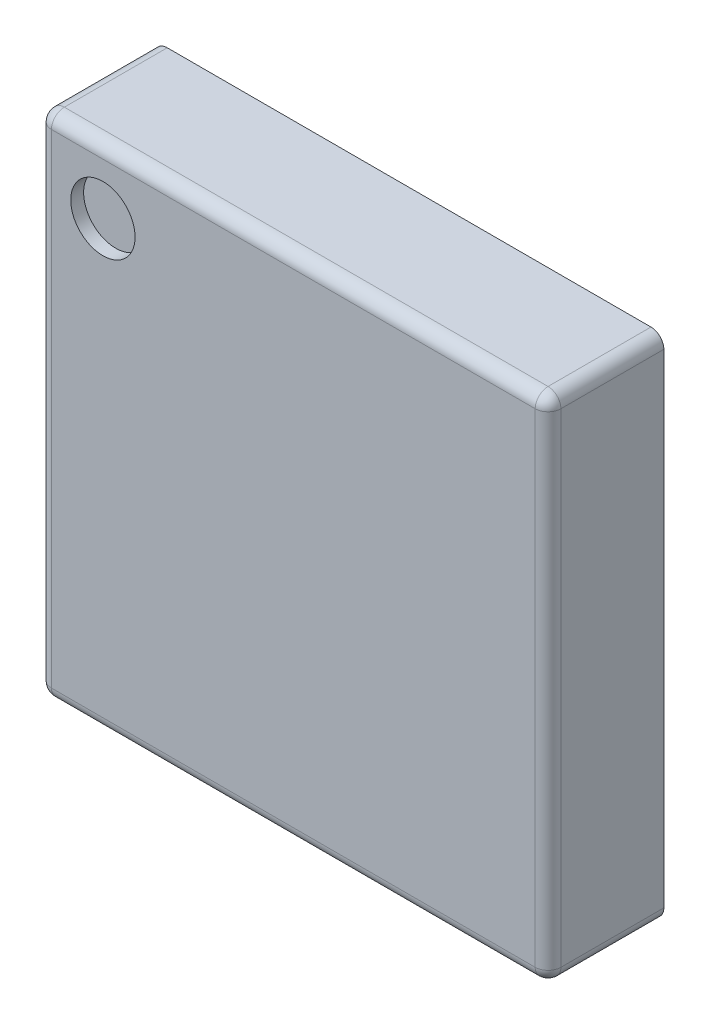
ISO-10303-21;
HEADER;
FILE_DESCRIPTION(('STEP AP214'),'2;1');
FILE_NAME('part.step','',(''),(''),'','','');
FILE_SCHEMA(('AUTOMOTIVE_DESIGN { 1 0 10303 214 1 1 1 1 }'));
ENDSEC;
DATA;
#1=APPLICATION_CONTEXT('core data for automotive mechanical design processes');
#2=APPLICATION_PROTOCOL_DEFINITION('international standard','automotive_design',2000,#1);
#3=PRODUCT_CONTEXT('',#1,'mechanical');
#4=PRODUCT('Part','Part','',(#3));
#5=PRODUCT_RELATED_PRODUCT_CATEGORY('part','',(#4));
#6=PRODUCT_DEFINITION_FORMATION('','',#4);
#7=PRODUCT_DEFINITION_CONTEXT('part definition',#1,'design');
#8=PRODUCT_DEFINITION('design','',#6,#7);
#9=PRODUCT_DEFINITION_SHAPE('','',#8);
#10=(LENGTH_UNIT() NAMED_UNIT(*) SI_UNIT(.MILLI.,.METRE.));
#11=(NAMED_UNIT(*) PLANE_ANGLE_UNIT() SI_UNIT($,.RADIAN.));
#12=(NAMED_UNIT(*) SI_UNIT($,.STERADIAN.) SOLID_ANGLE_UNIT());
#13=UNCERTAINTY_MEASURE_WITH_UNIT(LENGTH_MEASURE(1.E-05),#10,'distance_accuracy_value','');
#14=(GEOMETRIC_REPRESENTATION_CONTEXT(3) GLOBAL_UNCERTAINTY_ASSIGNED_CONTEXT((#13)) GLOBAL_UNIT_ASSIGNED_CONTEXT((#10,
#11,#12)) REPRESENTATION_CONTEXT('',''));
#15=CARTESIAN_POINT('',(0.,0.,0.));
#16=DIRECTION('',(0.,0.,1.));
#17=DIRECTION('',(1.,0.,0.));
#18=AXIS2_PLACEMENT_3D('',#15,#16,#17);
#19=CARTESIAN_POINT('',(0.,1.98,0.92));
#20=DIRECTION('',(0.,1.,0.));
#21=DIRECTION('',(1.,0.,0.));
#22=AXIS2_PLACEMENT_3D('',#19,#20,#21);
#23=PLANE('',#22);
#24=DIRECTION('',(1.,0.,0.));
#25=VECTOR('',#24,1.);
#26=CARTESIAN_POINT('',(0.,1.98,0.02));
#27=LINE('',#26,#25);
#28=CARTESIAN_POINT('',(-1.88,1.98,0.02));
#29=VERTEX_POINT('',#28);
#30=CARTESIAN_POINT('',(1.88,1.98,0.02));
#31=VERTEX_POINT('',#30);
#32=EDGE_CURVE('E39',#29,#31,#27,.T.);
#33=ORIENTED_EDGE('',*,*,#32,.F.);
#34=DIRECTION('',(0.,0.,1.));
#35=VECTOR('',#34,1.);
#36=CARTESIAN_POINT('',(-1.88,1.98,0.92));
#37=LINE('',#36,#35);
#38=CARTESIAN_POINT('',(-1.88,1.98,0.82));
#39=VERTEX_POINT('',#38);
#40=EDGE_CURVE('E11',#29,#39,#37,.T.);
#41=ORIENTED_EDGE('',*,*,#40,.T.);
#42=DIRECTION('',(1.,0.,0.));
#43=VECTOR('',#42,1.);
#44=CARTESIAN_POINT('',(0.,1.98,0.82));
#45=LINE('',#44,#43);
#46=CARTESIAN_POINT('',(1.88,1.98,0.82));
#47=VERTEX_POINT('',#46);
#48=EDGE_CURVE('E28',#39,#47,#45,.T.);
#49=ORIENTED_EDGE('',*,*,#48,.T.);
#50=DIRECTION('',(0.,0.,-1.));
#51=VECTOR('',#50,1.);
#52=CARTESIAN_POINT('',(1.88,1.98,0.92));
#53=LINE('',#52,#51);
#54=EDGE_CURVE('E138',#47,#31,#53,.T.);
#55=ORIENTED_EDGE('',*,*,#54,.T.);
#56=EDGE_LOOP('',(#33,#41,#49,#55));
#57=FACE_BOUND('',#56,.T.);
#58=ADVANCED_FACE('F17',(#57),#23,.T.);
#59=CARTESIAN_POINT('',(-1.98,0.,0.92));
#60=DIRECTION('',(1.,0.,0.));
#61=DIRECTION('',(0.,1.,0.));
#62=AXIS2_PLACEMENT_3D('',#59,#60,#61);
#63=PLANE('',#62);
#64=DIRECTION('',(0.,1.,0.));
#65=VECTOR('',#64,1.);
#66=CARTESIAN_POINT('',(-1.98,1.98,0.82));
#67=LINE('',#66,#65);
#68=CARTESIAN_POINT('',(-1.98,-1.88,0.82));
#69=VERTEX_POINT('',#68);
#70=CARTESIAN_POINT('',(-1.98,1.88,0.82));
#71=VERTEX_POINT('',#70);
#72=EDGE_CURVE('E144',#69,#71,#67,.T.);
#73=ORIENTED_EDGE('',*,*,#72,.T.);
#74=DIRECTION('',(0.,0.,-1.));
#75=VECTOR('',#74,1.);
#76=CARTESIAN_POINT('',(-1.98,1.88,0.02));
#77=LINE('',#76,#75);
#78=CARTESIAN_POINT('',(-1.98,1.88,0.02));
#79=VERTEX_POINT('',#78);
#80=EDGE_CURVE('E185',#71,#79,#77,.T.);
#81=ORIENTED_EDGE('',*,*,#80,.T.);
#82=DIRECTION('',(0.,-1.,0.));
#83=VECTOR('',#82,1.);
#84=CARTESIAN_POINT('',(-1.98,0.,0.02));
#85=LINE('',#84,#83);
#86=CARTESIAN_POINT('',(-1.98,-1.88,0.02));
#87=VERTEX_POINT('',#86);
#88=EDGE_CURVE('E251',#79,#87,#85,.T.);
#89=ORIENTED_EDGE('',*,*,#88,.T.);
#90=DIRECTION('',(0.,0.,1.));
#91=VECTOR('',#90,1.);
#92=CARTESIAN_POINT('',(-1.98,-1.88,0.92));
#93=LINE('',#92,#91);
#94=EDGE_CURVE('E191',#87,#69,#93,.T.);
#95=ORIENTED_EDGE('',*,*,#94,.T.);
#96=EDGE_LOOP('',(#73,#81,#89,#95));
#97=FACE_BOUND('',#96,.T.);
#98=ADVANCED_FACE('F421',(#97),#63,.F.);
#99=CARTESIAN_POINT('',(0.,-1.98,0.92));
#100=DIRECTION('',(0.,1.,0.));
#101=DIRECTION('',(1.,0.,0.));
#102=AXIS2_PLACEMENT_3D('',#99,#100,#101);
#103=PLANE('',#102);
#104=DIRECTION('',(-1.,0.,0.));
#105=VECTOR('',#104,1.);
#106=CARTESIAN_POINT('',(-1.98,-1.98,0.82));
#107=LINE('',#106,#105);
#108=CARTESIAN_POINT('',(1.88,-1.98,0.82));
#109=VERTEX_POINT('',#108);
#110=CARTESIAN_POINT('',(-1.88,-1.98,0.82));
#111=VERTEX_POINT('',#110);
#112=EDGE_CURVE('E187',#109,#111,#107,.T.);
#113=ORIENTED_EDGE('',*,*,#112,.T.);
#114=DIRECTION('',(0.,0.,-1.));
#115=VECTOR('',#114,1.);
#116=CARTESIAN_POINT('',(-1.88,-1.98,0.92));
#117=LINE('',#116,#115);
#118=CARTESIAN_POINT('',(-1.88,-1.98,0.02));
#119=VERTEX_POINT('',#118);
#120=EDGE_CURVE('E192',#111,#119,#117,.T.);
#121=ORIENTED_EDGE('',*,*,#120,.T.);
#122=DIRECTION('',(1.,0.,0.));
#123=VECTOR('',#122,1.);
#124=CARTESIAN_POINT('',(0.,-1.98,0.02));
#125=LINE('',#124,#123);
#126=CARTESIAN_POINT('',(1.88,-1.98,0.02));
#127=VERTEX_POINT('',#126);
#128=EDGE_CURVE('E171',#119,#127,#125,.T.);
#129=ORIENTED_EDGE('',*,*,#128,.T.);
#130=DIRECTION('',(0.,0.,1.));
#131=VECTOR('',#130,1.);
#132=CARTESIAN_POINT('',(1.88,-1.98,0.92));
#133=LINE('',#132,#131);
#134=EDGE_CURVE('E255',#127,#109,#133,.T.);
#135=ORIENTED_EDGE('',*,*,#134,.T.);
#136=EDGE_LOOP('',(#113,#121,#129,#135));
#137=FACE_BOUND('',#136,.T.);
#138=ADVANCED_FACE('F328',(#137),#103,.F.);
#139=CARTESIAN_POINT('',(1.98,0.,0.92));
#140=DIRECTION('',(1.,0.,0.));
#141=DIRECTION('',(0.,1.,0.));
#142=AXIS2_PLACEMENT_3D('',#139,#140,#141);
#143=PLANE('',#142);
#144=DIRECTION('',(0.,-1.,0.));
#145=VECTOR('',#144,1.);
#146=CARTESIAN_POINT('',(1.98,0.,0.82));
#147=LINE('',#146,#145);
#148=CARTESIAN_POINT('',(1.98,1.88,0.82));
#149=VERTEX_POINT('',#148);
#150=CARTESIAN_POINT('',(1.98,-1.88,0.82));
#151=VERTEX_POINT('',#150);
#152=EDGE_CURVE('E258',#149,#151,#147,.T.);
#153=ORIENTED_EDGE('',*,*,#152,.T.);
#154=DIRECTION('',(0.,0.,-1.));
#155=VECTOR('',#154,1.);
#156=CARTESIAN_POINT('',(1.98,-1.88,0.02));
#157=LINE('',#156,#155);
#158=CARTESIAN_POINT('',(1.98,-1.88,0.02));
#159=VERTEX_POINT('',#158);
#160=EDGE_CURVE('E212',#151,#159,#157,.T.);
#161=ORIENTED_EDGE('',*,*,#160,.T.);
#162=DIRECTION('',(0.,-1.,0.));
#163=VECTOR('',#162,1.);
#164=CARTESIAN_POINT('',(1.98,0.,0.02));
#165=LINE('',#164,#163);
#166=CARTESIAN_POINT('',(1.98,1.88,0.02));
#167=VERTEX_POINT('',#166);
#168=EDGE_CURVE('E208',#167,#159,#165,.T.);
#169=ORIENTED_EDGE('',*,*,#168,.F.);
#170=DIRECTION('',(0.,0.,1.));
#171=VECTOR('',#170,1.);
#172=CARTESIAN_POINT('',(1.98,1.88,0.92));
#173=LINE('',#172,#171);
#174=EDGE_CURVE('E177',#167,#149,#173,.T.);
#175=ORIENTED_EDGE('',*,*,#174,.T.);
#176=EDGE_LOOP('',(#153,#161,#169,#175));
#177=FACE_BOUND('',#176,.T.);
#178=ADVANCED_FACE('F323',(#177),#143,.T.);
#179=CARTESIAN_POINT('',(0.,0.,0.92));
#180=DIRECTION('',(0.,0.,1.));
#181=DIRECTION('',(1.,0.,0.));
#182=AXIS2_PLACEMENT_3D('',#179,#180,#181);
#183=PLANE('',#182);
#184=DIRECTION('',(0.,-1.,0.));
#185=VECTOR('',#184,1.);
#186=CARTESIAN_POINT('',(-1.88,-1.98,0.92));
#187=LINE('',#186,#185);
#188=CARTESIAN_POINT('',(-1.88,1.88,0.92));
#189=VERTEX_POINT('',#188);
#190=CARTESIAN_POINT('',(-1.88,-1.88,0.92));
#191=VERTEX_POINT('',#190);
#192=EDGE_CURVE('E173',#189,#191,#187,.T.);
#193=ORIENTED_EDGE('',*,*,#192,.T.);
#194=DIRECTION('',(1.,0.,0.));
#195=VECTOR('',#194,1.);
#196=CARTESIAN_POINT('',(1.98,-1.88,0.92));
#197=LINE('',#196,#195);
#198=CARTESIAN_POINT('',(1.88,-1.88,0.92));
#199=VERTEX_POINT('',#198);
#200=EDGE_CURVE('E178',#191,#199,#197,.T.);
#201=ORIENTED_EDGE('',*,*,#200,.T.);
#202=DIRECTION('',(0.,1.,0.));
#203=VECTOR('',#202,1.);
#204=CARTESIAN_POINT('',(1.88,0.,0.92));
#205=LINE('',#204,#203);
#206=CARTESIAN_POINT('',(1.88,1.88,0.92));
#207=VERTEX_POINT('',#206);
#208=EDGE_CURVE('E199',#199,#207,#205,.T.);
#209=ORIENTED_EDGE('',*,*,#208,.T.);
#210=DIRECTION('',(-1.,0.,0.));
#211=VECTOR('',#210,1.);
#212=CARTESIAN_POINT('',(0.,1.88,0.92));
#213=LINE('',#212,#211);
#214=EDGE_CURVE('E154',#207,#189,#213,.T.);
#215=ORIENTED_EDGE('',*,*,#214,.T.);
#216=EDGE_LOOP('',(#193,#201,#209,#215));
#217=FACE_BOUND('',#216,.T.);
#218=CARTESIAN_POINT('',(-1.48,1.48,0.92));
#219=DIRECTION('',(0.,0.,1.));
#220=DIRECTION('',(1.,0.,0.));
#221=AXIS2_PLACEMENT_3D('',#218,#219,#220);
#222=CIRCLE('',#221,0.25);
#223=CARTESIAN_POINT('',(-1.23,1.48,0.92));
#224=VERTEX_POINT('',#223);
#225=EDGE_CURVE('E235',#224,#224,#222,.T.);
#226=ORIENTED_EDGE('',*,*,#225,.F.);
#227=EDGE_LOOP('',(#226));
#228=FACE_BOUND('',#227,.T.);
#229=ADVANCED_FACE('F274',(#217,#228),#183,.T.);
#230=CARTESIAN_POINT('',(0.,0.,0.02));
#231=DIRECTION('',(0.,0.,1.));
#232=DIRECTION('',(1.,0.,0.));
#233=AXIS2_PLACEMENT_3D('',#230,#231,#232);
#234=PLANE('',#233);
#235=ORIENTED_EDGE('',*,*,#88,.F.);
#236=CARTESIAN_POINT('',(-1.88,1.88,0.02));
#237=DIRECTION('',(0.,0.,-1.));
#238=DIRECTION('',(1.,0.,0.));
#239=AXIS2_PLACEMENT_3D('',#236,#237,#238);
#240=CIRCLE('',#239,0.1);
#241=EDGE_CURVE('E200',#79,#29,#240,.T.);
#242=ORIENTED_EDGE('',*,*,#241,.T.);
#243=ORIENTED_EDGE('',*,*,#32,.T.);
#244=CARTESIAN_POINT('',(1.88,1.88,0.02));
#245=DIRECTION('',(0.,0.,-1.));
#246=DIRECTION('',(1.,0.,0.));
#247=AXIS2_PLACEMENT_3D('',#244,#245,#246);
#248=CIRCLE('',#247,0.1);
#249=EDGE_CURVE('E142',#31,#167,#248,.T.);
#250=ORIENTED_EDGE('',*,*,#249,.T.);
#251=ORIENTED_EDGE('',*,*,#168,.T.);
#252=CARTESIAN_POINT('',(1.88,-1.88,0.02));
#253=DIRECTION('',(0.,0.,-1.));
#254=DIRECTION('',(1.,0.,0.));
#255=AXIS2_PLACEMENT_3D('',#252,#253,#254);
#256=CIRCLE('',#255,0.1);
#257=EDGE_CURVE('E204',#159,#127,#256,.T.);
#258=ORIENTED_EDGE('',*,*,#257,.T.);
#259=ORIENTED_EDGE('',*,*,#128,.F.);
#260=CARTESIAN_POINT('',(-1.88,-1.88,0.02));
#261=DIRECTION('',(0.,0.,-1.));
#262=DIRECTION('',(1.,0.,0.));
#263=AXIS2_PLACEMENT_3D('',#260,#261,#262);
#264=CIRCLE('',#263,0.1);
#265=EDGE_CURVE('E209',#119,#87,#264,.T.);
#266=ORIENTED_EDGE('',*,*,#265,.T.);
#267=EDGE_LOOP('',(#235,#242,#243,#250,#251,#258,#259,#266));
#268=FACE_BOUND('',#267,.T.);
#269=ADVANCED_FACE('F321',(#268),#234,.F.);
#270=CARTESIAN_POINT('',(1.88,-1.88,0.92));
#271=DIRECTION('',(0.,0.,1.));
#272=DIRECTION('',(1.,0.,0.));
#273=AXIS2_PLACEMENT_3D('',#270,#271,#272);
#274=CYLINDRICAL_SURFACE('',#273,0.1);
#275=CARTESIAN_POINT('',(1.88,-1.88,0.82));
#276=DIRECTION('',(0.,0.,1.));
#277=DIRECTION('',(1.,0.,0.));
#278=AXIS2_PLACEMENT_3D('',#275,#276,#277);
#279=CIRCLE('',#278,0.1);
#280=EDGE_CURVE('E196',#109,#151,#279,.T.);
#281=ORIENTED_EDGE('',*,*,#280,.F.);
#282=ORIENTED_EDGE('',*,*,#134,.F.);
#283=ORIENTED_EDGE('',*,*,#257,.F.);
#284=ORIENTED_EDGE('',*,*,#160,.F.);
#285=EDGE_LOOP('',(#281,#282,#283,#284));
#286=FACE_BOUND('',#285,.T.);
#287=ADVANCED_FACE('F325',(#286),#274,.T.);
#288=CARTESIAN_POINT('',(1.88,-1.88,0.82));
#289=DIRECTION('',(1.,0.,0.));
#290=DIRECTION('',(0.,0.,-1.));
#291=AXIS2_PLACEMENT_3D('',#288,#289,#290);
#292=SPHERICAL_SURFACE('',#291,0.1);
#293=CARTESIAN_POINT('',(1.88,-1.88,0.82));
#294=DIRECTION('',(-1.,0.,0.));
#295=DIRECTION('',(0.,0.,-1.));
#296=AXIS2_PLACEMENT_3D('',#293,#294,#295);
#297=CIRCLE('',#296,0.1);
#298=EDGE_CURVE('E179',#109,#199,#297,.T.);
#299=ORIENTED_EDGE('',*,*,#298,.F.);
#300=ORIENTED_EDGE('',*,*,#280,.T.);
#301=CARTESIAN_POINT('',(1.88,-1.88,0.82));
#302=DIRECTION('',(0.,1.,0.));
#303=DIRECTION('',(0.,0.,-1.));
#304=AXIS2_PLACEMENT_3D('',#301,#302,#303);
#305=CIRCLE('',#304,0.1);
#306=EDGE_CURVE('E182',#199,#151,#305,.T.);
#307=ORIENTED_EDGE('',*,*,#306,.F.);
#308=EDGE_LOOP('',(#299,#300,#307));
#309=FACE_BOUND('',#308,.T.);
#310=ADVANCED_FACE('F288',(#309),#292,.T.);
#311=CARTESIAN_POINT('',(1.88,1.88,0.92));
#312=DIRECTION('',(0.,0.,-1.));
#313=DIRECTION('',(-1.,0.,0.));
#314=AXIS2_PLACEMENT_3D('',#311,#312,#313);
#315=CYLINDRICAL_SURFACE('',#314,0.1);
#316=ORIENTED_EDGE('',*,*,#249,.F.);
#317=ORIENTED_EDGE('',*,*,#54,.F.);
#318=CARTESIAN_POINT('',(1.88,1.88,0.82));
#319=DIRECTION('',(0.,0.,1.));
#320=DIRECTION('',(1.,0.,0.));
#321=AXIS2_PLACEMENT_3D('',#318,#319,#320);
#322=CIRCLE('',#321,0.1);
#323=EDGE_CURVE('E125',#149,#47,#322,.T.);
#324=ORIENTED_EDGE('',*,*,#323,.F.);
#325=ORIENTED_EDGE('',*,*,#174,.F.);
#326=EDGE_LOOP('',(#316,#317,#324,#325));
#327=FACE_BOUND('',#326,.T.);
#328=ADVANCED_FACE('F140',(#327),#315,.T.);
#329=CARTESIAN_POINT('',(1.88,0.,0.82));
#330=DIRECTION('',(0.,-1.,0.));
#331=DIRECTION('',(0.,0.,-1.));
#332=AXIS2_PLACEMENT_3D('',#329,#330,#331);
#333=CYLINDRICAL_SURFACE('',#332,0.1);
#334=ORIENTED_EDGE('',*,*,#306,.T.);
#335=ORIENTED_EDGE('',*,*,#152,.F.);
#336=CARTESIAN_POINT('',(1.88,1.88,0.82));
#337=DIRECTION('',(0.,1.,0.));
#338=DIRECTION('',(0.,0.,1.));
#339=AXIS2_PLACEMENT_3D('',#336,#337,#338);
#340=CIRCLE('',#339,0.1);
#341=EDGE_CURVE('E130',#207,#149,#340,.T.);
#342=ORIENTED_EDGE('',*,*,#341,.F.);
#343=ORIENTED_EDGE('',*,*,#208,.F.);
#344=EDGE_LOOP('',(#334,#335,#342,#343));
#345=FACE_BOUND('',#344,.T.);
#346=ADVANCED_FACE('F291',(#345),#333,.T.);
#347=CARTESIAN_POINT('',(0.,-1.88,0.82));
#348=DIRECTION('',(-1.,0.,0.));
#349=DIRECTION('',(0.,-1.,0.));
#350=AXIS2_PLACEMENT_3D('',#347,#348,#349);
#351=CYLINDRICAL_SURFACE('',#350,0.1);
#352=ORIENTED_EDGE('',*,*,#298,.T.);
#353=ORIENTED_EDGE('',*,*,#200,.F.);
#354=CARTESIAN_POINT('',(-1.88,-1.88,0.82));
#355=DIRECTION('',(-1.,0.,0.));
#356=DIRECTION('',(0.,0.,1.));
#357=AXIS2_PLACEMENT_3D('',#354,#355,#356);
#358=CIRCLE('',#357,0.1);
#359=EDGE_CURVE('E157',#111,#191,#358,.T.);
#360=ORIENTED_EDGE('',*,*,#359,.F.);
#361=ORIENTED_EDGE('',*,*,#112,.F.);
#362=EDGE_LOOP('',(#352,#353,#360,#361));
#363=FACE_BOUND('',#362,.T.);
#364=ADVANCED_FACE('F287',(#363),#351,.T.);
#365=CARTESIAN_POINT('',(-1.88,-1.88,0.92));
#366=DIRECTION('',(0.,0.,-1.));
#367=DIRECTION('',(-1.,0.,0.));
#368=AXIS2_PLACEMENT_3D('',#365,#366,#367);
#369=CYLINDRICAL_SURFACE('',#368,0.1);
#370=ORIENTED_EDGE('',*,*,#265,.F.);
#371=ORIENTED_EDGE('',*,*,#120,.F.);
#372=CARTESIAN_POINT('',(-1.88,-1.88,0.82));
#373=DIRECTION('',(0.,0.,1.));
#374=DIRECTION('',(1.,0.,0.));
#375=AXIS2_PLACEMENT_3D('',#372,#373,#374);
#376=CIRCLE('',#375,0.1);
#377=EDGE_CURVE('E135',#69,#111,#376,.T.);
#378=ORIENTED_EDGE('',*,*,#377,.F.);
#379=ORIENTED_EDGE('',*,*,#94,.F.);
#380=EDGE_LOOP('',(#370,#371,#378,#379));
#381=FACE_BOUND('',#380,.T.);
#382=ADVANCED_FACE('F453',(#381),#369,.T.);
#383=CARTESIAN_POINT('',(1.88,1.88,0.82));
#384=DIRECTION('',(1.,0.,0.));
#385=DIRECTION('',(0.,0.,-1.));
#386=AXIS2_PLACEMENT_3D('',#383,#384,#385);
#387=SPHERICAL_SURFACE('',#386,0.1);
#388=ORIENTED_EDGE('',*,*,#341,.T.);
#389=ORIENTED_EDGE('',*,*,#323,.T.);
#390=CARTESIAN_POINT('',(1.88,1.88,0.82));
#391=DIRECTION('',(-1.,0.,0.));
#392=DIRECTION('',(0.,0.,-1.));
#393=AXIS2_PLACEMENT_3D('',#390,#391,#392);
#394=CIRCLE('',#393,0.1);
#395=EDGE_CURVE('E129',#207,#47,#394,.T.);
#396=ORIENTED_EDGE('',*,*,#395,.F.);
#397=EDGE_LOOP('',(#388,#389,#396));
#398=FACE_BOUND('',#397,.T.);
#399=ADVANCED_FACE('F127',(#398),#387,.T.);
#400=CARTESIAN_POINT('',(-1.88,-1.88,0.82));
#401=DIRECTION('',(0.,-1.,0.));
#402=DIRECTION('',(0.,0.,-1.));
#403=AXIS2_PLACEMENT_3D('',#400,#401,#402);
#404=SPHERICAL_SURFACE('',#403,0.1);
#405=ORIENTED_EDGE('',*,*,#377,.T.);
#406=ORIENTED_EDGE('',*,*,#359,.T.);
#407=CARTESIAN_POINT('',(-1.88,-1.88,0.82));
#408=DIRECTION('',(0.,1.,0.));
#409=DIRECTION('',(0.,0.,-1.));
#410=AXIS2_PLACEMENT_3D('',#407,#408,#409);
#411=CIRCLE('',#410,0.1);
#412=EDGE_CURVE('E158',#69,#191,#411,.T.);
#413=ORIENTED_EDGE('',*,*,#412,.F.);
#414=EDGE_LOOP('',(#405,#406,#413));
#415=FACE_BOUND('',#414,.T.);
#416=ADVANCED_FACE('F282',(#415),#404,.T.);
#417=CARTESIAN_POINT('',(0.,1.88,0.82));
#418=DIRECTION('',(1.,0.,0.));
#419=DIRECTION('',(0.,1.,0.));
#420=AXIS2_PLACEMENT_3D('',#417,#418,#419);
#421=CYLINDRICAL_SURFACE('',#420,0.1);
#422=ORIENTED_EDGE('',*,*,#395,.T.);
#423=ORIENTED_EDGE('',*,*,#48,.F.);
#424=CARTESIAN_POINT('',(-1.88,1.88,0.82));
#425=DIRECTION('',(-1.,0.,0.));
#426=DIRECTION('',(0.,0.,1.));
#427=AXIS2_PLACEMENT_3D('',#424,#425,#426);
#428=CIRCLE('',#427,0.1);
#429=EDGE_CURVE('E21',#189,#39,#428,.T.);
#430=ORIENTED_EDGE('',*,*,#429,.F.);
#431=ORIENTED_EDGE('',*,*,#214,.F.);
#432=EDGE_LOOP('',(#422,#423,#430,#431));
#433=FACE_BOUND('',#432,.T.);
#434=ADVANCED_FACE('F152',(#433),#421,.T.);
#435=CARTESIAN_POINT('',(-1.88,0.,0.82));
#436=DIRECTION('',(0.,1.,0.));
#437=DIRECTION('',(0.,0.,1.));
#438=AXIS2_PLACEMENT_3D('',#435,#436,#437);
#439=CYLINDRICAL_SURFACE('',#438,0.1);
#440=ORIENTED_EDGE('',*,*,#412,.T.);
#441=ORIENTED_EDGE('',*,*,#192,.F.);
#442=CARTESIAN_POINT('',(-1.88,1.88,0.82));
#443=DIRECTION('',(0.,1.,0.));
#444=DIRECTION('',(0.,0.,1.));
#445=AXIS2_PLACEMENT_3D('',#442,#443,#444);
#446=CIRCLE('',#445,0.1);
#447=EDGE_CURVE('E167',#71,#189,#446,.T.);
#448=ORIENTED_EDGE('',*,*,#447,.F.);
#449=ORIENTED_EDGE('',*,*,#72,.F.);
#450=EDGE_LOOP('',(#440,#441,#448,#449));
#451=FACE_BOUND('',#450,.T.);
#452=ADVANCED_FACE('F278',(#451),#439,.T.);
#453=CARTESIAN_POINT('',(-1.88,1.88,0.82));
#454=DIRECTION('',(0.,0.,1.));
#455=DIRECTION('',(1.,0.,0.));
#456=AXIS2_PLACEMENT_3D('',#453,#454,#455);
#457=SPHERICAL_SURFACE('',#456,0.1);
#458=ORIENTED_EDGE('',*,*,#447,.T.);
#459=ORIENTED_EDGE('',*,*,#429,.T.);
#460=CARTESIAN_POINT('',(-1.88,1.88,0.82));
#461=DIRECTION('',(0.,0.,-1.));
#462=DIRECTION('',(1.,0.,0.));
#463=AXIS2_PLACEMENT_3D('',#460,#461,#462);
#464=CIRCLE('',#463,0.1);
#465=EDGE_CURVE('E242',#71,#39,#464,.T.);
#466=ORIENTED_EDGE('',*,*,#465,.F.);
#467=EDGE_LOOP('',(#458,#459,#466));
#468=FACE_BOUND('',#467,.T.);
#469=ADVANCED_FACE('F271',(#468),#457,.T.);
#470=CARTESIAN_POINT('',(-1.88,1.88,0.92));
#471=DIRECTION('',(0.,0.,1.));
#472=DIRECTION('',(1.,0.,0.));
#473=AXIS2_PLACEMENT_3D('',#470,#471,#472);
#474=CYLINDRICAL_SURFACE('',#473,0.1);
#475=ORIENTED_EDGE('',*,*,#465,.T.);
#476=ORIENTED_EDGE('',*,*,#40,.F.);
#477=ORIENTED_EDGE('',*,*,#241,.F.);
#478=ORIENTED_EDGE('',*,*,#80,.F.);
#479=EDGE_LOOP('',(#475,#476,#477,#478));
#480=FACE_BOUND('',#479,.T.);
#481=ADVANCED_FACE('F415',(#480),#474,.T.);
#482=CARTESIAN_POINT('',(-1.48,1.48,0.92));
#483=DIRECTION('',(0.,0.,-1.));
#484=DIRECTION('',(-1.,0.,0.));
#485=AXIS2_PLACEMENT_3D('',#482,#483,#484);
#486=CYLINDRICAL_SURFACE('',#485,0.25);
#487=ORIENTED_EDGE('',*,*,#225,.T.);
#488=DIRECTION('',(0.,0.,-1.));
#489=VECTOR('',#488,1.);
#490=CARTESIAN_POINT('',(-1.23,1.48,0.92));
#491=LINE('',#490,#489);
#492=CARTESIAN_POINT('',(-1.23,1.48,0.82));
#493=VERTEX_POINT('',#492);
#494=EDGE_CURVE('E231',#224,#493,#491,.T.);
#495=ORIENTED_EDGE('',*,*,#494,.T.);
#496=CARTESIAN_POINT('',(-1.48,1.48,0.82));
#497=DIRECTION('',(0.,0.,1.));
#498=DIRECTION('',(1.,0.,0.));
#499=AXIS2_PLACEMENT_3D('',#496,#497,#498);
#500=CIRCLE('',#499,0.25);
#501=EDGE_CURVE('E236',#493,#493,#500,.T.);
#502=ORIENTED_EDGE('',*,*,#501,.F.);
#503=ORIENTED_EDGE('',*,*,#494,.F.);
#504=EDGE_LOOP('',(#487,#495,#502,#503));
#505=FACE_BOUND('',#504,.T.);
#506=ADVANCED_FACE('F19',(#505),#486,.F.);
#507=CARTESIAN_POINT('',(-1.48,1.48,0.82));
#508=DIRECTION('',(0.,0.,1.));
#509=DIRECTION('',(1.,0.,0.));
#510=AXIS2_PLACEMENT_3D('',#507,#508,#509);
#511=PLANE('',#510);
#512=ORIENTED_EDGE('',*,*,#501,.T.);
#513=EDGE_LOOP('',(#512));
#514=FACE_BOUND('',#513,.T.);
#515=ADVANCED_FACE('F518',(#514),#511,.T.);
#516=CLOSED_SHELL('',(#58,#98,#138,#178,#229,#269,#287,#310,#328,#346,#364,#382,#399,#416,#434,
#452,#469,#481,#506,#515));
#517=MANIFOLD_SOLID_BREP('B1',#516);
#518=ADVANCED_BREP_SHAPE_REPRESENTATION('',(#18,#517),#14);
#519=SHAPE_DEFINITION_REPRESENTATION(#9,#518);
ENDSEC;
END-ISO-10303-21;
